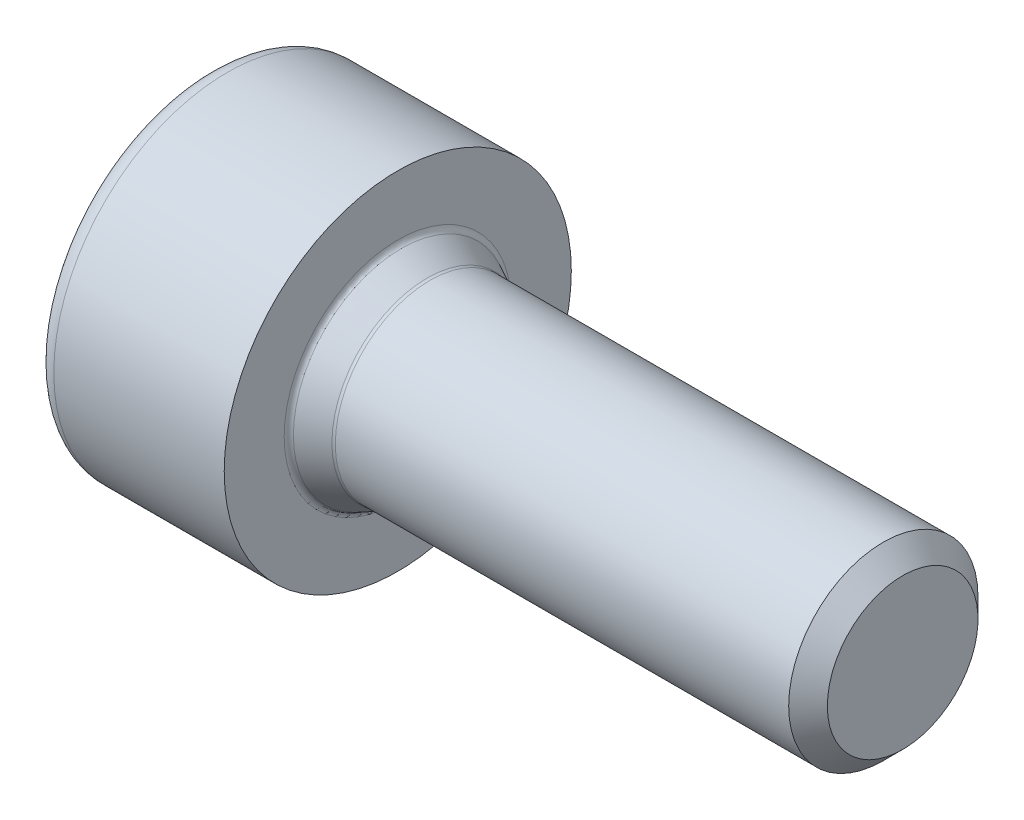
ISO-10303-21;
HEADER;
FILE_DESCRIPTION(('STEP AP214'),'2;1');
FILE_NAME('part.step','',(''),(''),'','','');
FILE_SCHEMA(('AUTOMOTIVE_DESIGN { 1 0 10303 214 1 1 1 1 }'));
ENDSEC;
DATA;
#1=APPLICATION_CONTEXT('core data for automotive mechanical design processes');
#2=APPLICATION_PROTOCOL_DEFINITION('international standard','automotive_design',2000,#1);
#3=PRODUCT_CONTEXT('',#1,'mechanical');
#4=PRODUCT('Part','Part','',(#3));
#5=PRODUCT_RELATED_PRODUCT_CATEGORY('part','',(#4));
#6=PRODUCT_DEFINITION_FORMATION('','',#4);
#7=PRODUCT_DEFINITION_CONTEXT('part definition',#1,'design');
#8=PRODUCT_DEFINITION('design','',#6,#7);
#9=PRODUCT_DEFINITION_SHAPE('','',#8);
#10=(LENGTH_UNIT() NAMED_UNIT(*) SI_UNIT(.MILLI.,.METRE.));
#11=(NAMED_UNIT(*) PLANE_ANGLE_UNIT() SI_UNIT($,.RADIAN.));
#12=(NAMED_UNIT(*) SI_UNIT($,.STERADIAN.) SOLID_ANGLE_UNIT());
#13=UNCERTAINTY_MEASURE_WITH_UNIT(LENGTH_MEASURE(1.E-05),#10,'distance_accuracy_value','');
#14=(GEOMETRIC_REPRESENTATION_CONTEXT(3) GLOBAL_UNCERTAINTY_ASSIGNED_CONTEXT((#13)) GLOBAL_UNIT_ASSIGNED_CONTEXT((#10,
#11,#12)) REPRESENTATION_CONTEXT('',''));
#15=CARTESIAN_POINT('',(0.,0.,0.));
#16=DIRECTION('',(0.,0.,1.));
#17=DIRECTION('',(1.,0.,0.));
#18=AXIS2_PLACEMENT_3D('',#15,#16,#17);
#19=CARTESIAN_POINT('',(-3.,1.25,0.));
#20=DIRECTION('',(1.,0.,0.));
#21=DIRECTION('',(0.,0.,-1.));
#22=AXIS2_PLACEMENT_3D('',#19,#20,#21);
#23=PLANE('',#22);
#24=DIRECTION('',(0.,0.50000000000002,-0.866025403784427));
#25=VECTOR('',#24,1.);
#26=CARTESIAN_POINT('',(-3.,-0.770031754730522,-1.16626587736532));
#27=LINE('',#26,#25);
#28=CARTESIAN_POINT('',(-3.,-1.4433756729741,0.));
#29=VERTEX_POINT('',#28);
#30=CARTESIAN_POINT('',(-3.,-0.72168783648703,-1.25));
#31=VERTEX_POINT('',#30);
#32=EDGE_CURVE('E196',#29,#31,#27,.T.);
#33=ORIENTED_EDGE('',*,*,#32,.T.);
#34=DIRECTION('',(0.,1.,0.));
#35=VECTOR('',#34,1.);
#36=CARTESIAN_POINT('',(-3.,1.25,-1.25));
#37=LINE('',#36,#35);
#38=CARTESIAN_POINT('',(-3.,0.72168783648703,-1.25));
#39=VERTEX_POINT('',#38);
#40=EDGE_CURVE('E11',#31,#39,#37,.T.);
#41=ORIENTED_EDGE('',*,*,#40,.T.);
#42=DIRECTION('',(0.,0.50000000000002,0.866025403784427));
#43=VECTOR('',#42,1.);
#44=CARTESIAN_POINT('',(-3.,1.39503175473057,-0.0837341226347435));
#45=LINE('',#44,#43);
#46=CARTESIAN_POINT('',(-3.,1.4433756729741,0.));
#47=VERTEX_POINT('',#46);
#48=EDGE_CURVE('E45',#39,#47,#45,.T.);
#49=ORIENTED_EDGE('',*,*,#48,.T.);
#50=DIRECTION('',(0.,-0.50000000000002,0.866025403784427));
#51=VECTOR('',#50,1.);
#52=CARTESIAN_POINT('',(-3.,1.39503175473057,0.0837341226347435));
#53=LINE('',#52,#51);
#54=CARTESIAN_POINT('',(-3.,0.72168783648703,1.25));
#55=VERTEX_POINT('',#54);
#56=EDGE_CURVE('E194',#47,#55,#53,.T.);
#57=ORIENTED_EDGE('',*,*,#56,.T.);
#58=DIRECTION('',(0.,-1.,0.));
#59=VECTOR('',#58,1.);
#60=CARTESIAN_POINT('',(-3.,1.25,1.25));
#61=LINE('',#60,#59);
#62=CARTESIAN_POINT('',(-3.,-0.72168783648703,1.25));
#63=VERTEX_POINT('',#62);
#64=EDGE_CURVE('E129',#55,#63,#61,.T.);
#65=ORIENTED_EDGE('',*,*,#64,.T.);
#66=DIRECTION('',(0.,-0.50000000000002,-0.866025403784427));
#67=VECTOR('',#66,1.);
#68=CARTESIAN_POINT('',(-3.,-0.770031754730522,1.16626587736532));
#69=LINE('',#68,#67);
#70=EDGE_CURVE('E192',#63,#29,#69,.T.);
#71=ORIENTED_EDGE('',*,*,#70,.T.);
#72=EDGE_LOOP('',(#33,#41,#49,#57,#65,#71));
#73=FACE_BOUND('',#72,.T.);
#74=CARTESIAN_POINT('',(-3.,0.,0.));
#75=DIRECTION('',(-1.,0.,0.));
#76=DIRECTION('',(0.,0.,1.));
#77=AXIS2_PLACEMENT_3D('',#74,#75,#76);
#78=CIRCLE('',#77,2.45);
#79=CARTESIAN_POINT('',(-3.,0.,2.45));
#80=VERTEX_POINT('',#79);
#81=EDGE_CURVE('E185',#80,#80,#78,.T.);
#82=ORIENTED_EDGE('',*,*,#81,.T.);
#83=EDGE_LOOP('',(#82));
#84=FACE_BOUND('',#83,.T.);
#85=ADVANCED_FACE('F37',(#73,#84),#23,.F.);
#86=CARTESIAN_POINT('',(-2.70000000000012,0.,0.));
#87=DIRECTION('',(-1.,0.,0.));
#88=DIRECTION('',(0.,0.,1.));
#89=AXIS2_PLACEMENT_3D('',#86,#87,#88);
#90=TOROIDAL_SURFACE('',#89,2.45000000000012,0.299999999999878);
#91=ORIENTED_EDGE('',*,*,#81,.F.);
#92=EDGE_LOOP('',(#91));
#93=FACE_BOUND('',#92,.T.);
#94=CARTESIAN_POINT('',(-2.7,0.,0.));
#95=DIRECTION('',(-1.,0.,0.));
#96=DIRECTION('',(0.,0.,1.));
#97=AXIS2_PLACEMENT_3D('',#94,#95,#96);
#98=CIRCLE('',#97,2.75);
#99=CARTESIAN_POINT('',(-2.7,0.,2.75));
#100=VERTEX_POINT('',#99);
#101=EDGE_CURVE('E182',#100,#100,#98,.T.);
#102=ORIENTED_EDGE('',*,*,#101,.T.);
#103=EDGE_LOOP('',(#102));
#104=FACE_BOUND('',#103,.T.);
#105=ADVANCED_FACE('F253',(#93,#104),#90,.T.);
#106=CARTESIAN_POINT('',(8.,0.,0.));
#107=DIRECTION('',(-1.,0.,0.));
#108=DIRECTION('',(0.,0.,1.));
#109=AXIS2_PLACEMENT_3D('',#106,#107,#108);
#110=CYLINDRICAL_SURFACE('',#109,2.75);
#111=ORIENTED_EDGE('',*,*,#101,.F.);
#112=EDGE_LOOP('',(#111));
#113=FACE_BOUND('',#112,.T.);
#114=CARTESIAN_POINT('',(0.,0.,0.));
#115=DIRECTION('',(-1.,0.,0.));
#116=DIRECTION('',(0.,0.,1.));
#117=AXIS2_PLACEMENT_3D('',#114,#115,#116);
#118=CIRCLE('',#117,2.75);
#119=CARTESIAN_POINT('',(0.,0.,2.75));
#120=VERTEX_POINT('',#119);
#121=EDGE_CURVE('E179',#120,#120,#118,.T.);
#122=ORIENTED_EDGE('',*,*,#121,.T.);
#123=EDGE_LOOP('',(#122));
#124=FACE_BOUND('',#123,.T.);
#125=ADVANCED_FACE('F257',(#113,#124),#110,.T.);
#126=CARTESIAN_POINT('',(0.,2.75,0.));
#127=DIRECTION('',(-1.,0.,0.));
#128=DIRECTION('',(0.,0.,1.));
#129=AXIS2_PLACEMENT_3D('',#126,#127,#128);
#130=PLANE('',#129);
#131=ORIENTED_EDGE('',*,*,#121,.F.);
#132=EDGE_LOOP('',(#131));
#133=FACE_BOUND('',#132,.T.);
#134=CARTESIAN_POINT('',(0.,0.,0.));
#135=DIRECTION('',(-1.,0.,0.));
#136=DIRECTION('',(0.,0.,1.));
#137=AXIS2_PLACEMENT_3D('',#134,#135,#136);
#138=CIRCLE('',#137,1.8);
#139=CARTESIAN_POINT('',(0.,0.,1.8));
#140=VERTEX_POINT('',#139);
#141=EDGE_CURVE('E176',#140,#140,#138,.T.);
#142=ORIENTED_EDGE('',*,*,#141,.T.);
#143=EDGE_LOOP('',(#142));
#144=FACE_BOUND('',#143,.T.);
#145=ADVANCED_FACE('F263',(#133,#144),#130,.F.);
#146=CARTESIAN_POINT('',(0.0999999999999561,0.,0.));
#147=DIRECTION('',(-1.,0.,0.));
#148=DIRECTION('',(0.,0.,1.));
#149=AXIS2_PLACEMENT_3D('',#146,#147,#148);
#150=TOROIDAL_SURFACE('',#149,1.79999999999996,0.0999999999999561);
#151=ORIENTED_EDGE('',*,*,#141,.F.);
#152=EDGE_LOOP('',(#151));
#153=FACE_BOUND('',#152,.T.);
#154=CARTESIAN_POINT('',(0.0561576367978586,0.,0.));
#155=DIRECTION('',(-1.,0.,0.));
#156=DIRECTION('',(0.,0.,1.));
#157=AXIS2_PLACEMENT_3D('',#154,#155,#156);
#158=CIRCLE('',#157,1.7101231554356);
#159=CARTESIAN_POINT('',(0.0561576367978586,0.,1.7101231554356));
#160=VERTEX_POINT('',#159);
#161=EDGE_CURVE('E173',#160,#160,#158,.T.);
#162=ORIENTED_EDGE('',*,*,#161,.T.);
#163=EDGE_LOOP('',(#162));
#164=FACE_BOUND('',#163,.T.);
#165=ADVANCED_FACE('F267',(#153,#164),#150,.F.);
#166=CARTESIAN_POINT('',(0.46615763679786,0.,0.));
#167=DIRECTION('',(-1.,0.,0.));
#168=DIRECTION('',(0.,0.,1.));
#169=AXIS2_PLACEMENT_3D('',#166,#167,#168);
#170=CONICAL_SURFACE('',#169,1.5101231554356,0.453844001521508);
#171=ORIENTED_EDGE('',*,*,#161,.F.);
#172=EDGE_LOOP('',(#171));
#173=FACE_BOUND('',#172,.T.);
#174=CARTESIAN_POINT('',(0.46615763679786,0.,0.));
#175=DIRECTION('',(-1.,0.,0.));
#176=DIRECTION('',(0.,0.,1.));
#177=AXIS2_PLACEMENT_3D('',#174,#175,#176);
#178=CIRCLE('',#177,1.5101231554356);
#179=CARTESIAN_POINT('',(0.46615763679786,0.,1.5101231554356));
#180=VERTEX_POINT('',#179);
#181=EDGE_CURVE('E170',#180,#180,#178,.T.);
#182=ORIENTED_EDGE('',*,*,#181,.T.);
#183=EDGE_LOOP('',(#182));
#184=FACE_BOUND('',#183,.T.);
#185=ADVANCED_FACE('F271',(#173,#184),#170,.T.);
#186=CARTESIAN_POINT('',(0.50999999999974,0.,0.));
#187=DIRECTION('',(-1.,0.,0.));
#188=DIRECTION('',(0.,0.,1.));
#189=AXIS2_PLACEMENT_3D('',#186,#187,#188);
#190=TOROIDAL_SURFACE('',#189,1.59999999999896,0.0999999999989575);
#191=ORIENTED_EDGE('',*,*,#181,.F.);
#192=EDGE_LOOP('',(#191));
#193=FACE_BOUND('',#192,.T.);
#194=CARTESIAN_POINT('',(0.51,0.,0.));
#195=DIRECTION('',(-1.,0.,0.));
#196=DIRECTION('',(0.,0.,1.));
#197=AXIS2_PLACEMENT_3D('',#194,#195,#196);
#198=CIRCLE('',#197,1.5);
#199=CARTESIAN_POINT('',(0.51,0.,1.5));
#200=VERTEX_POINT('',#199);
#201=EDGE_CURVE('E167',#200,#200,#198,.T.);
#202=ORIENTED_EDGE('',*,*,#201,.T.);
#203=EDGE_LOOP('',(#202));
#204=FACE_BOUND('',#203,.T.);
#205=ADVANCED_FACE('F275',(#193,#204),#190,.F.);
#206=CARTESIAN_POINT('',(8.,0.,0.));
#207=DIRECTION('',(-1.,0.,0.));
#208=DIRECTION('',(0.,0.,1.));
#209=AXIS2_PLACEMENT_3D('',#206,#207,#208);
#210=CYLINDRICAL_SURFACE('',#209,1.5);
#211=ORIENTED_EDGE('',*,*,#201,.F.);
#212=EDGE_LOOP('',(#211));
#213=FACE_BOUND('',#212,.T.);
#214=CARTESIAN_POINT('',(7.6935,0.,0.));
#215=DIRECTION('',(-1.,0.,0.));
#216=DIRECTION('',(0.,0.,1.));
#217=AXIS2_PLACEMENT_3D('',#214,#215,#216);
#218=CIRCLE('',#217,1.5);
#219=CARTESIAN_POINT('',(7.6935,0.,1.5));
#220=VERTEX_POINT('',#219);
#221=EDGE_CURVE('E164',#220,#220,#218,.T.);
#222=ORIENTED_EDGE('',*,*,#221,.T.);
#223=EDGE_LOOP('',(#222));
#224=FACE_BOUND('',#223,.T.);
#225=ADVANCED_FACE('F279',(#213,#224),#210,.T.);
#226=CARTESIAN_POINT('',(8.,0.,0.));
#227=DIRECTION('',(-1.,0.,0.));
#228=DIRECTION('',(0.,0.,1.));
#229=AXIS2_PLACEMENT_3D('',#226,#227,#228);
#230=CONICAL_SURFACE('',#229,1.1935,0.785398163397448);
#231=ORIENTED_EDGE('',*,*,#221,.F.);
#232=EDGE_LOOP('',(#231));
#233=FACE_BOUND('',#232,.T.);
#234=CARTESIAN_POINT('',(8.,0.,0.));
#235=DIRECTION('',(-1.,0.,0.));
#236=DIRECTION('',(0.,0.,1.));
#237=AXIS2_PLACEMENT_3D('',#234,#235,#236);
#238=CIRCLE('',#237,1.1935);
#239=CARTESIAN_POINT('',(8.,0.,1.1935));
#240=VERTEX_POINT('',#239);
#241=EDGE_CURVE('E154',#240,#240,#238,.T.);
#242=ORIENTED_EDGE('',*,*,#241,.T.);
#243=EDGE_LOOP('',(#242));
#244=FACE_BOUND('',#243,.T.);
#245=ADVANCED_FACE('F246',(#233,#244),#230,.T.);
#246=CARTESIAN_POINT('',(8.,1.1935,0.));
#247=DIRECTION('',(-1.,0.,0.));
#248=DIRECTION('',(0.,0.,1.));
#249=AXIS2_PLACEMENT_3D('',#246,#247,#248);
#250=PLANE('',#249);
#251=ORIENTED_EDGE('',*,*,#241,.F.);
#252=EDGE_LOOP('',(#251));
#253=FACE_BOUND('',#252,.T.);
#254=ADVANCED_FACE('F240',(#253),#250,.F.);
#255=CARTESIAN_POINT('',(-1.15,0.,0.));
#256=DIRECTION('',(1.,0.,0.));
#257=DIRECTION('',(0.,0.,-1.));
#258=AXIS2_PLACEMENT_3D('',#255,#256,#257);
#259=PLANE('',#258);
#260=DIRECTION('',(0.,1.,0.));
#261=VECTOR('',#260,1.);
#262=CARTESIAN_POINT('',(-1.15,-0.72168783648703,-1.25));
#263=LINE('',#262,#261);
#264=CARTESIAN_POINT('',(-1.15,-0.72168783648703,-1.25));
#265=VERTEX_POINT('',#264);
#266=CARTESIAN_POINT('',(-1.15,0.,-1.25));
#267=VERTEX_POINT('',#266);
#268=EDGE_CURVE('E52',#265,#267,#263,.T.);
#269=ORIENTED_EDGE('',*,*,#268,.F.);
#270=DIRECTION('',(0.,0.50000000000002,-0.866025403784427));
#271=VECTOR('',#270,1.);
#272=CARTESIAN_POINT('',(-1.15,-1.4433756729741,0.));
#273=LINE('',#272,#271);
#274=CARTESIAN_POINT('',(-1.15,-1.08253175473055,-0.625000000000032));
#275=VERTEX_POINT('',#274);
#276=EDGE_CURVE('E143',#275,#265,#273,.T.);
#277=ORIENTED_EDGE('',*,*,#276,.F.);
#278=CARTESIAN_POINT('',(-1.15,0.,0.));
#279=DIRECTION('',(-1.,0.,0.));
#280=DIRECTION('',(0.,0.,1.));
#281=AXIS2_PLACEMENT_3D('',#278,#279,#280);
#282=CIRCLE('',#281,1.25);
#283=EDGE_CURVE('E218',#267,#275,#282,.T.);
#284=ORIENTED_EDGE('',*,*,#283,.F.);
#285=EDGE_LOOP('',(#269,#277,#284));
#286=FACE_BOUND('',#285,.T.);
#287=ADVANCED_FACE('F238',(#286),#259,.F.);
#288=CARTESIAN_POINT('',(-1.15,-1.4433756729741,0.));
#289=VERTEX_POINT('',#288);
#290=EDGE_CURVE('E144',#289,#275,#273,.T.);
#291=ORIENTED_EDGE('',*,*,#290,.F.);
#292=DIRECTION('',(0.,-0.50000000000002,-0.866025403784427));
#293=VECTOR('',#292,1.);
#294=CARTESIAN_POINT('',(-1.15,-0.72168783648703,1.25));
#295=LINE('',#294,#293);
#296=CARTESIAN_POINT('',(-1.15,-1.08253175473055,0.625000000000032));
#297=VERTEX_POINT('',#296);
#298=EDGE_CURVE('E135',#297,#289,#295,.T.);
#299=ORIENTED_EDGE('',*,*,#298,.F.);
#300=EDGE_CURVE('E219',#275,#297,#282,.T.);
#301=ORIENTED_EDGE('',*,*,#300,.F.);
#302=EDGE_LOOP('',(#291,#299,#301));
#303=FACE_BOUND('',#302,.T.);
#304=ADVANCED_FACE('F227',(#303),#259,.F.);
#305=CARTESIAN_POINT('',(-1.15,-0.72168783648703,1.25));
#306=VERTEX_POINT('',#305);
#307=EDGE_CURVE('E139',#306,#297,#295,.T.);
#308=ORIENTED_EDGE('',*,*,#307,.F.);
#309=DIRECTION('',(0.,-1.,0.));
#310=VECTOR('',#309,1.);
#311=CARTESIAN_POINT('',(-1.15,0.72168783648703,1.25));
#312=LINE('',#311,#310);
#313=CARTESIAN_POINT('',(-1.15,0.,1.25));
#314=VERTEX_POINT('',#313);
#315=EDGE_CURVE('E136',#314,#306,#312,.T.);
#316=ORIENTED_EDGE('',*,*,#315,.F.);
#317=EDGE_CURVE('E188',#297,#314,#282,.T.);
#318=ORIENTED_EDGE('',*,*,#317,.F.);
#319=EDGE_LOOP('',(#308,#316,#318));
#320=FACE_BOUND('',#319,.T.);
#321=ADVANCED_FACE('F224',(#320),#259,.F.);
#322=CARTESIAN_POINT('',(-1.15,0.72168783648703,1.25));
#323=VERTEX_POINT('',#322);
#324=EDGE_CURVE('E126',#323,#314,#312,.T.);
#325=ORIENTED_EDGE('',*,*,#324,.F.);
#326=DIRECTION('',(0.,-0.50000000000002,0.866025403784427));
#327=VECTOR('',#326,1.);
#328=CARTESIAN_POINT('',(-1.15,1.4433756729741,0.));
#329=LINE('',#328,#327);
#330=CARTESIAN_POINT('',(-1.15,1.08253175473055,0.625000000000032));
#331=VERTEX_POINT('',#330);
#332=EDGE_CURVE('E113',#331,#323,#329,.T.);
#333=ORIENTED_EDGE('',*,*,#332,.F.);
#334=EDGE_CURVE('E133',#314,#331,#282,.T.);
#335=ORIENTED_EDGE('',*,*,#334,.F.);
#336=EDGE_LOOP('',(#325,#333,#335));
#337=FACE_BOUND('',#336,.T.);
#338=ADVANCED_FACE('F132',(#337),#259,.F.);
#339=CARTESIAN_POINT('',(-1.15,1.4433756729741,0.));
#340=VERTEX_POINT('',#339);
#341=EDGE_CURVE('E119',#340,#331,#329,.T.);
#342=ORIENTED_EDGE('',*,*,#341,.F.);
#343=DIRECTION('',(0.,0.50000000000002,0.866025403784427));
#344=VECTOR('',#343,1.);
#345=CARTESIAN_POINT('',(-1.15,0.72168783648703,-1.25));
#346=LINE('',#345,#344);
#347=CARTESIAN_POINT('',(-1.15,1.08253175473055,-0.625000000000032));
#348=VERTEX_POINT('',#347);
#349=EDGE_CURVE('E149',#348,#340,#346,.T.);
#350=ORIENTED_EDGE('',*,*,#349,.F.);
#351=EDGE_CURVE('E190',#331,#348,#282,.T.);
#352=ORIENTED_EDGE('',*,*,#351,.F.);
#353=EDGE_LOOP('',(#342,#350,#352));
#354=FACE_BOUND('',#353,.T.);
#355=ADVANCED_FACE('F251',(#354),#259,.F.);
#356=CARTESIAN_POINT('',(-1.15,0.72168783648703,-1.25));
#357=VERTEX_POINT('',#356);
#358=EDGE_CURVE('E130',#357,#348,#346,.T.);
#359=ORIENTED_EDGE('',*,*,#358,.F.);
#360=EDGE_CURVE('E147',#267,#357,#263,.T.);
#361=ORIENTED_EDGE('',*,*,#360,.F.);
#362=EDGE_CURVE('E212',#348,#267,#282,.T.);
#363=ORIENTED_EDGE('',*,*,#362,.F.);
#364=EDGE_LOOP('',(#359,#361,#363));
#365=FACE_BOUND('',#364,.T.);
#366=ADVANCED_FACE('F210',(#365),#259,.F.);
#367=CARTESIAN_POINT('',(-3.75,1.4433756729741,0.));
#368=DIRECTION('',(0.,0.866025403784427,0.50000000000002));
#369=DIRECTION('',(0.,-0.50000000000002,0.866025403784427));
#370=AXIS2_PLACEMENT_3D('',#367,#368,#369);
#371=PLANE('',#370);
#372=ORIENTED_EDGE('',*,*,#56,.F.);
#373=DIRECTION('',(1.,0.,0.));
#374=VECTOR('',#373,1.);
#375=CARTESIAN_POINT('',(-3.75,1.4433756729741,0.));
#376=LINE('',#375,#374);
#377=EDGE_CURVE('E152',#47,#340,#376,.T.);
#378=ORIENTED_EDGE('',*,*,#377,.T.);
#379=ORIENTED_EDGE('',*,*,#341,.T.);
#380=ORIENTED_EDGE('',*,*,#332,.T.);
#381=DIRECTION('',(1.,0.,0.));
#382=VECTOR('',#381,1.);
#383=CARTESIAN_POINT('',(-3.75,0.72168783648703,1.25));
#384=LINE('',#383,#382);
#385=EDGE_CURVE('E116',#55,#323,#384,.T.);
#386=ORIENTED_EDGE('',*,*,#385,.F.);
#387=EDGE_LOOP('',(#372,#378,#379,#380,#386));
#388=FACE_BOUND('',#387,.T.);
#389=ADVANCED_FACE('F115',(#388),#371,.F.);
#390=CARTESIAN_POINT('',(-3.75,0.72168783648703,-1.25));
#391=DIRECTION('',(0.,0.866025403784427,-0.50000000000002));
#392=DIRECTION('',(0.,0.50000000000002,0.866025403784427));
#393=AXIS2_PLACEMENT_3D('',#390,#391,#392);
#394=PLANE('',#393);
#395=ORIENTED_EDGE('',*,*,#48,.F.);
#396=DIRECTION('',(1.,0.,0.));
#397=VECTOR('',#396,1.);
#398=CARTESIAN_POINT('',(-3.75,0.72168783648703,-1.25));
#399=LINE('',#398,#397);
#400=EDGE_CURVE('E155',#39,#357,#399,.T.);
#401=ORIENTED_EDGE('',*,*,#400,.T.);
#402=ORIENTED_EDGE('',*,*,#358,.T.);
#403=ORIENTED_EDGE('',*,*,#349,.T.);
#404=ORIENTED_EDGE('',*,*,#377,.F.);
#405=EDGE_LOOP('',(#395,#401,#402,#403,#404));
#406=FACE_BOUND('',#405,.T.);
#407=ADVANCED_FACE('F204',(#406),#394,.F.);
#408=CARTESIAN_POINT('',(-3.75,-0.72168783648703,-1.25));
#409=DIRECTION('',(0.,0.,-1.));
#410=DIRECTION('',(-1.,0.,0.));
#411=AXIS2_PLACEMENT_3D('',#408,#409,#410);
#412=PLANE('',#411);
#413=ORIENTED_EDGE('',*,*,#40,.F.);
#414=DIRECTION('',(1.,0.,0.));
#415=VECTOR('',#414,1.);
#416=CARTESIAN_POINT('',(-3.75,-0.72168783648703,-1.25));
#417=LINE('',#416,#415);
#418=EDGE_CURVE('E157',#31,#265,#417,.T.);
#419=ORIENTED_EDGE('',*,*,#418,.T.);
#420=ORIENTED_EDGE('',*,*,#268,.T.);
#421=ORIENTED_EDGE('',*,*,#360,.T.);
#422=ORIENTED_EDGE('',*,*,#400,.F.);
#423=EDGE_LOOP('',(#413,#419,#420,#421,#422));
#424=FACE_BOUND('',#423,.T.);
#425=ADVANCED_FACE('F206',(#424),#412,.F.);
#426=CARTESIAN_POINT('',(-3.75,-1.4433756729741,0.));
#427=DIRECTION('',(0.,-0.866025403784427,-0.50000000000002));
#428=DIRECTION('',(0.,0.50000000000002,-0.866025403784427));
#429=AXIS2_PLACEMENT_3D('',#426,#427,#428);
#430=PLANE('',#429);
#431=ORIENTED_EDGE('',*,*,#32,.F.);
#432=DIRECTION('',(1.,0.,0.));
#433=VECTOR('',#432,1.);
#434=CARTESIAN_POINT('',(-3.75,-1.4433756729741,0.));
#435=LINE('',#434,#433);
#436=EDGE_CURVE('E159',#29,#289,#435,.T.);
#437=ORIENTED_EDGE('',*,*,#436,.T.);
#438=ORIENTED_EDGE('',*,*,#290,.T.);
#439=ORIENTED_EDGE('',*,*,#276,.T.);
#440=ORIENTED_EDGE('',*,*,#418,.F.);
#441=EDGE_LOOP('',(#431,#437,#438,#439,#440));
#442=FACE_BOUND('',#441,.T.);
#443=ADVANCED_FACE('F235',(#442),#430,.F.);
#444=CARTESIAN_POINT('',(-3.75,-0.72168783648703,1.25));
#445=DIRECTION('',(0.,-0.866025403784427,0.50000000000002));
#446=DIRECTION('',(0.,-0.50000000000002,-0.866025403784427));
#447=AXIS2_PLACEMENT_3D('',#444,#445,#446);
#448=PLANE('',#447);
#449=ORIENTED_EDGE('',*,*,#70,.F.);
#450=DIRECTION('',(1.,0.,0.));
#451=VECTOR('',#450,1.);
#452=CARTESIAN_POINT('',(-3.75,-0.72168783648703,1.25));
#453=LINE('',#452,#451);
#454=EDGE_CURVE('E60',#63,#306,#453,.T.);
#455=ORIENTED_EDGE('',*,*,#454,.T.);
#456=ORIENTED_EDGE('',*,*,#307,.T.);
#457=ORIENTED_EDGE('',*,*,#298,.T.);
#458=ORIENTED_EDGE('',*,*,#436,.F.);
#459=EDGE_LOOP('',(#449,#455,#456,#457,#458));
#460=FACE_BOUND('',#459,.T.);
#461=ADVANCED_FACE('F231',(#460),#448,.F.);
#462=CARTESIAN_POINT('',(-3.75,0.72168783648703,1.25));
#463=DIRECTION('',(0.,0.,1.));
#464=DIRECTION('',(1.,0.,0.));
#465=AXIS2_PLACEMENT_3D('',#462,#463,#464);
#466=PLANE('',#465);
#467=ORIENTED_EDGE('',*,*,#64,.F.);
#468=ORIENTED_EDGE('',*,*,#385,.T.);
#469=ORIENTED_EDGE('',*,*,#324,.T.);
#470=ORIENTED_EDGE('',*,*,#315,.T.);
#471=ORIENTED_EDGE('',*,*,#454,.F.);
#472=EDGE_LOOP('',(#467,#468,#469,#470,#471));
#473=FACE_BOUND('',#472,.T.);
#474=ADVANCED_FACE('F125',(#473),#466,.F.);
#475=CARTESIAN_POINT('',(-1.15,0.,0.));
#476=DIRECTION('',(-1.,0.,0.));
#477=DIRECTION('',(0.,0.,1.));
#478=AXIS2_PLACEMENT_3D('',#475,#476,#477);
#479=CONICAL_SURFACE('',#478,1.25,1.0471975511966);
#480=CARTESIAN_POINT('',(-0.42831216351297,0.,0.));
#481=VERTEX_POINT('',#480);
#482=VERTEX_LOOP('',#481);
#483=FACE_BOUND('',#482,.T.);
#484=ORIENTED_EDGE('',*,*,#334,.T.);
#485=ORIENTED_EDGE('',*,*,#351,.T.);
#486=ORIENTED_EDGE('',*,*,#362,.T.);
#487=ORIENTED_EDGE('',*,*,#283,.T.);
#488=ORIENTED_EDGE('',*,*,#300,.T.);
#489=ORIENTED_EDGE('',*,*,#317,.T.);
#490=EDGE_LOOP('',(#484,#485,#486,#487,#488,#489));
#491=FACE_BOUND('',#490,.T.);
#492=ADVANCED_FACE('F39',(#483,#491),#479,.F.);
#493=CLOSED_SHELL('',(#85,#105,#125,#145,#165,#185,#205,#225,#245,#254,#287,#304,#321,#338,#355,
#366,#389,#407,#425,#443,#461,#474,#492));
#494=MANIFOLD_SOLID_BREP('B2',#493);
#495=ADVANCED_BREP_SHAPE_REPRESENTATION('',(#18,#494),#14);
#496=SHAPE_DEFINITION_REPRESENTATION(#9,#495);
ENDSEC;
END-ISO-10303-21;
